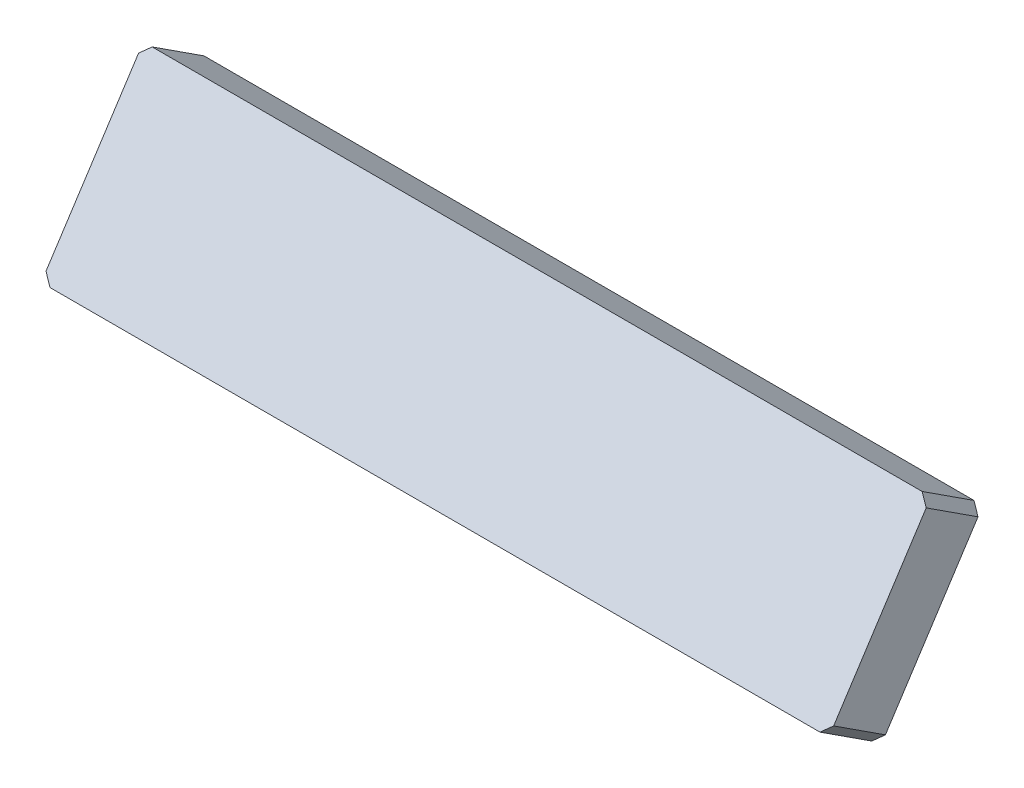
ISO-10303-21;
HEADER;
FILE_DESCRIPTION(('STEP AP214'),'2;1');
FILE_NAME('part.step','',(''),(''),'','','');
FILE_SCHEMA(('AUTOMOTIVE_DESIGN { 1 0 10303 214 1 1 1 1 }'));
ENDSEC;
DATA;
#1=APPLICATION_CONTEXT('core data for automotive mechanical design processes');
#2=APPLICATION_PROTOCOL_DEFINITION('international standard','automotive_design',2000,#1);
#3=PRODUCT_CONTEXT('',#1,'mechanical');
#4=PRODUCT('Part','Part','',(#3));
#5=PRODUCT_RELATED_PRODUCT_CATEGORY('part','',(#4));
#6=PRODUCT_DEFINITION_FORMATION('','',#4);
#7=PRODUCT_DEFINITION_CONTEXT('part definition',#1,'design');
#8=PRODUCT_DEFINITION('design','',#6,#7);
#9=PRODUCT_DEFINITION_SHAPE('','',#8);
#10=(LENGTH_UNIT() NAMED_UNIT(*) SI_UNIT(.MILLI.,.METRE.));
#11=(NAMED_UNIT(*) PLANE_ANGLE_UNIT() SI_UNIT($,.RADIAN.));
#12=(NAMED_UNIT(*) SI_UNIT($,.STERADIAN.) SOLID_ANGLE_UNIT());
#13=UNCERTAINTY_MEASURE_WITH_UNIT(LENGTH_MEASURE(1.E-05),#10,'distance_accuracy_value','');
#14=(GEOMETRIC_REPRESENTATION_CONTEXT(3) GLOBAL_UNCERTAINTY_ASSIGNED_CONTEXT((#13)) GLOBAL_UNIT_ASSIGNED_CONTEXT((#10,
#11,#12)) REPRESENTATION_CONTEXT('',''));
#15=CARTESIAN_POINT('',(0.,0.,0.));
#16=DIRECTION('',(0.,0.,1.));
#17=DIRECTION('',(1.,0.,0.));
#18=AXIS2_PLACEMENT_3D('',#15,#16,#17);
#19=CARTESIAN_POINT('',(0.,5.65083347470302,8.70152048404578));
#20=DIRECTION('',(0.,0.544639035015028,0.838670567945423));
#21=DIRECTION('',(0.,-0.838670567945423,0.544639035015028));
#22=AXIS2_PLACEMENT_3D('',#19,#20,#21);
#23=PLANE('',#22);
#24=DIRECTION('',(-1.,0.,0.));
#25=VECTOR('',#24,1.);
#26=CARTESIAN_POINT('',(-70.85,6.22882369253435,8.32616924779223));
#27=LINE('',#26,#25);
#28=CARTESIAN_POINT('',(69.2625,6.22882369253434,8.32616924779223));
#29=VERTEX_POINT('',#28);
#30=CARTESIAN_POINT('',(-69.2625,6.22882369253435,8.32616924779223));
#31=VERTEX_POINT('',#30);
#32=EDGE_CURVE('E172',#29,#31,#27,.T.);
#33=ORIENTED_EDGE('',*,*,#32,.T.);
#34=DIRECTION('',(0.,0.838670567945423,-0.544639035015028));
#35=VECTOR('',#34,1.);
#36=CARTESIAN_POINT('',(-69.2625,5.65083347470302,8.70152048404578));
#37=LINE('',#36,#35);
#38=CARTESIAN_POINT('',(-69.2625,31.8711763074657,-8.32616924779225));
#39=VERTEX_POINT('',#38);
#40=EDGE_CURVE('E175',#31,#39,#37,.T.);
#41=ORIENTED_EDGE('',*,*,#40,.T.);
#42=DIRECTION('',(1.,0.,0.));
#43=VECTOR('',#42,1.);
#44=CARTESIAN_POINT('',(0.,31.8711763074657,-8.32616924779225));
#45=LINE('',#44,#43);
#46=CARTESIAN_POINT('',(69.2625,31.8711763074656,-8.32616924779225));
#47=VERTEX_POINT('',#46);
#48=EDGE_CURVE('E166',#39,#47,#45,.T.);
#49=ORIENTED_EDGE('',*,*,#48,.T.);
#50=DIRECTION('',(0.,-0.838670567945423,0.544639035015028));
#51=VECTOR('',#50,1.);
#52=CARTESIAN_POINT('',(69.2625,4.89743416592097,9.1907837158786));
#53=LINE('',#52,#51);
#54=EDGE_CURVE('E169',#47,#29,#53,.T.);
#55=ORIENTED_EDGE('',*,*,#54,.T.);
#56=EDGE_LOOP('',(#33,#41,#49,#55));
#57=FACE_BOUND('',#56,.T.);
#58=CARTESIAN_POINT('',(-50.8,19.05,0.));
#59=DIRECTION('',(0.,0.544639035015028,0.838670567945423));
#60=DIRECTION('',(0.,-0.838670567945423,0.544639035015028));
#61=AXIS2_PLACEMENT_3D('',#58,#59,#60);
#62=ELLIPSE('',#61,13.9541962867026,7.6);
#63=CARTESIAN_POINT('',(-50.8,7.34702627500917,7.60000000000002));
#64=VERTEX_POINT('',#63);
#65=EDGE_CURVE('E268',#64,#64,#62,.T.);
#66=ORIENTED_EDGE('',*,*,#65,.T.);
#67=EDGE_LOOP('',(#66));
#68=FACE_BOUND('',#67,.T.);
#69=CARTESIAN_POINT('',(50.8,19.05,0.));
#70=DIRECTION('',(0.,0.544639035015028,0.838670567945423));
#71=DIRECTION('',(0.,-0.838670567945423,0.544639035015028));
#72=AXIS2_PLACEMENT_3D('',#69,#70,#71);
#73=ELLIPSE('',#72,13.9541962867026,7.6);
#74=CARTESIAN_POINT('',(50.8,7.34702627500921,7.59999999999998));
#75=VERTEX_POINT('',#74);
#76=EDGE_CURVE('E154',#75,#75,#73,.F.);
#77=ORIENTED_EDGE('',*,*,#76,.F.);
#78=EDGE_LOOP('',(#77));
#79=FACE_BOUND('',#78,.T.);
#80=ADVANCED_FACE('F47',(#57,#68,#79),#23,.F.);
#81=CARTESIAN_POINT('',(-50.8,19.05,0.));
#82=DIRECTION('',(0.,-1.,0.));
#83=DIRECTION('',(0.,0.,-1.));
#84=AXIS2_PLACEMENT_3D('',#81,#82,#83);
#85=CYLINDRICAL_SURFACE('',#84,7.6);
#86=CARTESIAN_POINT('',(-50.8,0.,0.));
#87=DIRECTION('',(0.,1.,0.));
#88=DIRECTION('',(0.,0.,1.));
#89=AXIS2_PLACEMENT_3D('',#86,#87,#88);
#90=CIRCLE('',#89,7.6);
#91=CARTESIAN_POINT('',(-50.8,0.,7.60000000000001));
#92=VERTEX_POINT('',#91);
#93=EDGE_CURVE('E160',#92,#92,#90,.T.);
#94=ORIENTED_EDGE('',*,*,#93,.T.);
#95=EDGE_LOOP('',(#94));
#96=FACE_BOUND('',#95,.T.);
#97=ORIENTED_EDGE('',*,*,#65,.F.);
#98=EDGE_LOOP('',(#97));
#99=FACE_BOUND('',#98,.T.);
#100=ADVANCED_FACE('F275',(#96,#99),#85,.T.);
#101=CARTESIAN_POINT('',(-50.8,0.,0.));
#102=DIRECTION('',(0.,1.,0.));
#103=DIRECTION('',(0.,0.,1.));
#104=AXIS2_PLACEMENT_3D('',#101,#102,#103);
#105=PLANE('',#104);
#106=ORIENTED_EDGE('',*,*,#93,.F.);
#107=EDGE_LOOP('',(#106));
#108=FACE_BOUND('',#107,.T.);
#109=ADVANCED_FACE('F278',(#108),#105,.F.);
#110=CARTESIAN_POINT('',(0.,40.1194815787699,1.46033249702826));
#111=DIRECTION('',(0.,-0.838670567945423,0.544639035015028));
#112=DIRECTION('',(0.,-0.544639035015028,-0.838670567945423));
#113=AXIS2_PLACEMENT_3D('',#110,#111,#112);
#114=PLANE('',#113);
#115=DIRECTION('',(-1.,0.,0.));
#116=VECTOR('',#115,1.);
#117=CARTESIAN_POINT('',(0.,40.1194815787699,1.46033249702826));
#118=LINE('',#117,#116);
#119=CARTESIAN_POINT('',(69.2625,40.1194815787699,1.46033249702826));
#120=VERTEX_POINT('',#119);
#121=CARTESIAN_POINT('',(-69.2625,40.1194815787699,1.46033249702827));
#122=VERTEX_POINT('',#121);
#123=EDGE_CURVE('E131',#120,#122,#118,.T.);
#124=ORIENTED_EDGE('',*,*,#123,.F.);
#125=DIRECTION('',(0.,-0.544639035015028,-0.838670567945423));
#126=VECTOR('',#125,1.);
#127=CARTESIAN_POINT('',(69.2625,33.202565834079,-9.19078371587862));
#128=LINE('',#127,#126);
#129=CARTESIAN_POINT('',(69.2625,34.0671803021654,-7.85939418926524));
#130=VERTEX_POINT('',#129);
#131=EDGE_CURVE('E11',#120,#130,#128,.T.);
#132=ORIENTED_EDGE('',*,*,#131,.T.);
#133=DIRECTION('',(-1.,0.,0.));
#134=VECTOR('',#133,1.);
#135=CARTESIAN_POINT('',(0.,34.0671803021654,-7.85939418926524));
#136=LINE('',#135,#134);
#137=CARTESIAN_POINT('',(-69.2625,34.0671803021654,-7.85939418926523));
#138=VERTEX_POINT('',#137);
#139=EDGE_CURVE('E58',#130,#138,#136,.T.);
#140=ORIENTED_EDGE('',*,*,#139,.T.);
#141=DIRECTION('',(0.,0.544639035015028,0.838670567945423));
#142=VECTOR('',#141,1.);
#143=CARTESIAN_POINT('',(-69.2625,40.1194815787699,1.46033249702826));
#144=LINE('',#143,#142);
#145=EDGE_CURVE('E204',#138,#122,#144,.T.);
#146=ORIENTED_EDGE('',*,*,#145,.T.);
#147=EDGE_LOOP('',(#124,#132,#140,#146));
#148=FACE_BOUND('',#147,.T.);
#149=ADVANCED_FACE('F280',(#148),#114,.F.);
#150=CARTESIAN_POINT('',(-70.85,12.5677492193939,19.3526366969527));
#151=DIRECTION('',(1.,0.,0.));
#152=DIRECTION('',(0.,0.,-1.));
#153=AXIS2_PLACEMENT_3D('',#150,#151,#152);
#154=PLANE('',#153);
#155=DIRECTION('',(0.,-0.838670567945423,0.544639035015028));
#156=VECTOR('',#155,1.);
#157=CARTESIAN_POINT('',(-70.85,6.51544794278938,10.0329100106591));
#158=LINE('',#157,#156);
#159=CARTESIAN_POINT('',(-70.85,32.735790775552,-6.99477972117888));
#160=VERTEX_POINT('',#159);
#161=CARTESIAN_POINT('',(-70.85,7.09343816062071,9.6575587744056));
#162=VERTEX_POINT('',#161);
#163=EDGE_CURVE('E153',#160,#162,#158,.T.);
#164=ORIENTED_EDGE('',*,*,#163,.T.);
#165=DIRECTION('',(0.,0.544639035015028,0.838670567945424));
#166=VECTOR('',#165,1.);
#167=CARTESIAN_POINT('',(-70.85,13.1457394372252,18.9772854606991));
#168=LINE('',#167,#166);
#169=CARTESIAN_POINT('',(-70.85,13.1457394372252,18.9772854606991));
#170=VERTEX_POINT('',#169);
#171=EDGE_CURVE('E144',#162,#170,#168,.T.);
#172=ORIENTED_EDGE('',*,*,#171,.T.);
#173=DIRECTION('',(0.,-0.838670567945423,0.544639035015028));
#174=VECTOR('',#173,1.);
#175=CARTESIAN_POINT('',(-70.85,12.5677492193939,19.3526366969527));
#176=LINE('',#175,#174);
#177=CARTESIAN_POINT('',(-70.85,38.7880920521565,2.32494696511463));
#178=VERTEX_POINT('',#177);
#179=EDGE_CURVE('E129',#178,#170,#176,.T.);
#180=ORIENTED_EDGE('',*,*,#179,.F.);
#181=DIRECTION('',(0.,-0.544639035015028,-0.838670567945424));
#182=VECTOR('',#181,1.);
#183=CARTESIAN_POINT('',(-70.85,38.7880920521565,2.32494696511463));
#184=LINE('',#183,#182);
#185=EDGE_CURVE('E141',#178,#160,#184,.T.);
#186=ORIENTED_EDGE('',*,*,#185,.T.);
#187=EDGE_LOOP('',(#164,#172,#180,#186));
#188=FACE_BOUND('',#187,.T.);
#189=ADVANCED_FACE('F140',(#188),#154,.F.);
#190=CARTESIAN_POINT('',(0.,11.8143499106118,19.8418999287855));
#191=DIRECTION('',(0.,-0.838670567945423,0.544639035015028));
#192=DIRECTION('',(0.,-0.544639035015028,-0.838670567945423));
#193=AXIS2_PLACEMENT_3D('',#190,#191,#192);
#194=PLANE('',#193);
#195=DIRECTION('',(-1.,0.,0.));
#196=VECTOR('',#195,1.);
#197=CARTESIAN_POINT('',(0.,11.8143499106118,19.8418999287855));
#198=LINE('',#197,#196);
#199=CARTESIAN_POINT('',(69.2625,11.8143499106118,19.8418999287855));
#200=VERTEX_POINT('',#199);
#201=CARTESIAN_POINT('',(-69.2625,11.8143499106118,19.8418999287855));
#202=VERTEX_POINT('',#201);
#203=EDGE_CURVE('E146',#200,#202,#198,.T.);
#204=ORIENTED_EDGE('',*,*,#203,.T.);
#205=DIRECTION('',(0.,-0.544639035015028,-0.838670567945423));
#206=VECTOR('',#205,1.);
#207=CARTESIAN_POINT('',(-69.2625,4.89743416592098,9.1907837158786));
#208=LINE('',#207,#206);
#209=CARTESIAN_POINT('',(-69.2625,5.76204863400735,10.522173242492));
#210=VERTEX_POINT('',#209);
#211=EDGE_CURVE('E136',#202,#210,#208,.T.);
#212=ORIENTED_EDGE('',*,*,#211,.T.);
#213=DIRECTION('',(1.,0.,0.));
#214=VECTOR('',#213,1.);
#215=CARTESIAN_POINT('',(70.85,5.76204863400734,10.522173242492));
#216=LINE('',#215,#214);
#217=CARTESIAN_POINT('',(69.2625,5.76204863400734,10.522173242492));
#218=VERTEX_POINT('',#217);
#219=EDGE_CURVE('E182',#210,#218,#216,.T.);
#220=ORIENTED_EDGE('',*,*,#219,.T.);
#221=DIRECTION('',(0.,0.544639035015028,0.838670567945423));
#222=VECTOR('',#221,1.);
#223=CARTESIAN_POINT('',(69.2625,11.8143499106118,19.8418999287855));
#224=LINE('',#223,#222);
#225=EDGE_CURVE('E179',#218,#200,#224,.T.);
#226=ORIENTED_EDGE('',*,*,#225,.T.);
#227=EDGE_LOOP('',(#204,#212,#220,#226));
#228=FACE_BOUND('',#227,.T.);
#229=ADVANCED_FACE('F300',(#228),#194,.T.);
#230=CARTESIAN_POINT('',(70.85,12.5677492193939,19.3526366969526));
#231=DIRECTION('',(1.,0.,0.));
#232=DIRECTION('',(0.,0.,-1.));
#233=AXIS2_PLACEMENT_3D('',#230,#231,#232);
#234=PLANE('',#233);
#235=DIRECTION('',(0.,-0.838670567945423,0.544639035015028));
#236=VECTOR('',#235,1.);
#237=CARTESIAN_POINT('',(70.85,12.5677492193939,19.3526366969526));
#238=LINE('',#237,#236);
#239=CARTESIAN_POINT('',(70.85,38.7880920521565,2.32494696511462));
#240=VERTEX_POINT('',#239);
#241=CARTESIAN_POINT('',(70.85,13.1457394372252,18.9772854606991));
#242=VERTEX_POINT('',#241);
#243=EDGE_CURVE('E264',#240,#242,#238,.T.);
#244=ORIENTED_EDGE('',*,*,#243,.T.);
#245=DIRECTION('',(0.,-0.544639035015028,-0.838670567945424));
#246=VECTOR('',#245,1.);
#247=CARTESIAN_POINT('',(70.85,13.1457394372252,18.9772854606991));
#248=LINE('',#247,#246);
#249=CARTESIAN_POINT('',(70.85,7.09343816062071,9.6575587744056));
#250=VERTEX_POINT('',#249);
#251=EDGE_CURVE('E201',#242,#250,#248,.T.);
#252=ORIENTED_EDGE('',*,*,#251,.T.);
#253=DIRECTION('',(0.,0.838670567945423,-0.544639035015028));
#254=VECTOR('',#253,1.);
#255=CARTESIAN_POINT('',(70.85,34.0671803021654,-7.85939418926524));
#256=LINE('',#255,#254);
#257=CARTESIAN_POINT('',(70.85,32.735790775552,-6.99477972117888));
#258=VERTEX_POINT('',#257);
#259=EDGE_CURVE('E198',#250,#258,#256,.T.);
#260=ORIENTED_EDGE('',*,*,#259,.T.);
#261=DIRECTION('',(0.,0.544639035015028,0.838670567945424));
#262=VECTOR('',#261,1.);
#263=CARTESIAN_POINT('',(70.85,38.7880920521565,2.32494696511462));
#264=LINE('',#263,#262);
#265=EDGE_CURVE('E195',#258,#240,#264,.T.);
#266=ORIENTED_EDGE('',*,*,#265,.T.);
#267=EDGE_LOOP('',(#244,#252,#260,#266));
#268=FACE_BOUND('',#267,.T.);
#269=ADVANCED_FACE('F297',(#268),#234,.T.);
#270=CARTESIAN_POINT('',(0.,12.5677492193939,19.3526366969527));
#271=DIRECTION('',(0.,0.544639035015028,0.838670567945423));
#272=DIRECTION('',(0.,-0.838670567945423,0.544639035015028));
#273=AXIS2_PLACEMENT_3D('',#270,#271,#272);
#274=PLANE('',#273);
#275=ORIENTED_EDGE('',*,*,#179,.T.);
#276=DIRECTION('',(0.70710678118655,-0.59302964577578,0.385117954958022));
#277=VECTOR('',#276,1.);
#278=CARTESIAN_POINT('',(-35.0804128403196,-16.8531605411571,38.4587988942333));
#279=LINE('',#278,#277);
#280=EDGE_CURVE('E192',#170,#202,#279,.T.);
#281=ORIENTED_EDGE('',*,*,#280,.T.);
#282=ORIENTED_EDGE('',*,*,#203,.F.);
#283=DIRECTION('',(-0.70710678118655,-0.59302964577578,0.385117954958023));
#284=VECTOR('',#283,1.);
#285=CARTESIAN_POINT('',(35.0804128403196,-16.8531605411571,38.4587988942332));
#286=LINE('',#285,#284);
#287=EDGE_CURVE('E189',#200,#242,#286,.F.);
#288=ORIENTED_EDGE('',*,*,#287,.T.);
#289=ORIENTED_EDGE('',*,*,#243,.F.);
#290=DIRECTION('',(-0.70710678118655,0.59302964577578,-0.385117954958023));
#291=VECTOR('',#290,1.);
#292=CARTESIAN_POINT('',(51.0570871596799,55.3878255052419,-8.45504598437379));
#293=LINE('',#292,#291);
#294=EDGE_CURVE('E135',#240,#120,#293,.T.);
#295=ORIENTED_EDGE('',*,*,#294,.T.);
#296=ORIENTED_EDGE('',*,*,#123,.T.);
#297=DIRECTION('',(0.70710678118655,0.59302964577578,-0.385117954958022));
#298=VECTOR('',#297,1.);
#299=CARTESIAN_POINT('',(-51.0570871596799,55.3878255052419,-8.4550459843738));
#300=LINE('',#299,#298);
#301=EDGE_CURVE('E126',#122,#178,#300,.F.);
#302=ORIENTED_EDGE('',*,*,#301,.T.);
#303=EDGE_LOOP('',(#275,#281,#282,#288,#289,#295,#296,#302));
#304=FACE_BOUND('',#303,.T.);
#305=ADVANCED_FACE('F128',(#304),#274,.T.);
#306=CARTESIAN_POINT('',(50.8,19.05,0.));
#307=DIRECTION('',(0.,-1.,0.));
#308=DIRECTION('',(0.,0.,-1.));
#309=AXIS2_PLACEMENT_3D('',#306,#307,#308);
#310=CYLINDRICAL_SURFACE('',#309,7.6);
#311=CARTESIAN_POINT('',(50.8,0.,0.));
#312=DIRECTION('',(0.,1.,0.));
#313=DIRECTION('',(0.,0.,1.));
#314=AXIS2_PLACEMENT_3D('',#311,#312,#313);
#315=CIRCLE('',#314,7.6);
#316=CARTESIAN_POINT('',(50.8,0.,7.59999999999998));
#317=VERTEX_POINT('',#316);
#318=EDGE_CURVE('E251',#317,#317,#315,.T.);
#319=ORIENTED_EDGE('',*,*,#318,.T.);
#320=EDGE_LOOP('',(#319));
#321=FACE_BOUND('',#320,.T.);
#322=ORIENTED_EDGE('',*,*,#76,.T.);
#323=EDGE_LOOP('',(#322));
#324=FACE_BOUND('',#323,.T.);
#325=ADVANCED_FACE('F324',(#321,#324),#310,.T.);
#326=CARTESIAN_POINT('',(50.8,0.,0.));
#327=DIRECTION('',(0.,1.,0.));
#328=DIRECTION('',(0.,0.,1.));
#329=AXIS2_PLACEMENT_3D('',#326,#327,#328);
#330=PLANE('',#329);
#331=ORIENTED_EDGE('',*,*,#318,.F.);
#332=EDGE_LOOP('',(#331));
#333=FACE_BOUND('',#332,.T.);
#334=ADVANCED_FACE('F331',(#333),#330,.F.);
#335=CARTESIAN_POINT('',(69.2625,40.1194815787699,1.46033249702826));
#336=DIRECTION('',(0.707106781186545,0.593029645775784,-0.385117954958025));
#337=DIRECTION('',(0.,0.544639035015028,0.838670567945423));
#338=AXIS2_PLACEMENT_3D('',#335,#336,#337);
#339=PLANE('',#338);
#340=ORIENTED_EDGE('',*,*,#294,.F.);
#341=ORIENTED_EDGE('',*,*,#265,.F.);
#342=DIRECTION('',(0.70710678118655,-0.593029645775779,0.385117954958023));
#343=VECTOR('',#342,1.);
#344=CARTESIAN_POINT('',(70.85,32.735790775552,-6.99477972117888));
#345=LINE('',#344,#343);
#346=EDGE_CURVE('E244',#130,#258,#345,.T.);
#347=ORIENTED_EDGE('',*,*,#346,.F.);
#348=ORIENTED_EDGE('',*,*,#131,.F.);
#349=EDGE_LOOP('',(#340,#341,#347,#348));
#350=FACE_BOUND('',#349,.T.);
#351=ADVANCED_FACE('F50',(#350),#339,.T.);
#352=CARTESIAN_POINT('',(70.85,13.1457394372252,18.9772854606991));
#353=DIRECTION('',(-0.707106781186545,0.593029645775784,-0.385117954958025));
#354=DIRECTION('',(0.,-0.544639035015028,-0.838670567945423));
#355=AXIS2_PLACEMENT_3D('',#352,#353,#354);
#356=PLANE('',#355);
#357=ORIENTED_EDGE('',*,*,#287,.F.);
#358=ORIENTED_EDGE('',*,*,#225,.F.);
#359=DIRECTION('',(0.70710678118655,0.59302964577578,-0.385117954958022));
#360=VECTOR('',#359,1.);
#361=CARTESIAN_POINT('',(69.2625,5.76204863400734,10.522173242492));
#362=LINE('',#361,#360);
#363=EDGE_CURVE('E241',#250,#218,#362,.F.);
#364=ORIENTED_EDGE('',*,*,#363,.F.);
#365=ORIENTED_EDGE('',*,*,#251,.F.);
#366=EDGE_LOOP('',(#357,#358,#364,#365));
#367=FACE_BOUND('',#366,.T.);
#368=ADVANCED_FACE('F344',(#367),#356,.F.);
#369=CARTESIAN_POINT('',(69.2625,5.65083347470302,8.70152048404577));
#370=DIRECTION('',(0.70710678118655,-0.385117954958022,-0.59302964577578));
#371=DIRECTION('',(0.,0.838670567945423,-0.544639035015028));
#372=AXIS2_PLACEMENT_3D('',#369,#370,#371);
#373=PLANE('',#372);
#374=DIRECTION('',(-0.707106781186545,-0.385117954958026,-0.593029645775784));
#375=VECTOR('',#374,1.);
#376=CARTESIAN_POINT('',(70.85,32.735790775552,-6.99477972117888));
#377=LINE('',#376,#375);
#378=EDGE_CURVE('E52',#258,#47,#377,.T.);
#379=ORIENTED_EDGE('',*,*,#378,.F.);
#380=ORIENTED_EDGE('',*,*,#259,.F.);
#381=DIRECTION('',(0.707106781186545,0.385117954958026,0.593029645775784));
#382=VECTOR('',#381,1.);
#383=CARTESIAN_POINT('',(70.05625,6.66113092657752,8.99186401109891));
#384=LINE('',#383,#382);
#385=EDGE_CURVE('E237',#29,#250,#384,.T.);
#386=ORIENTED_EDGE('',*,*,#385,.F.);
#387=ORIENTED_EDGE('',*,*,#54,.F.);
#388=EDGE_LOOP('',(#379,#380,#386,#387));
#389=FACE_BOUND('',#388,.T.);
#390=ADVANCED_FACE('F351',(#389),#373,.T.);
#391=CARTESIAN_POINT('',(70.85,32.735790775552,-6.99477972117888));
#392=DIRECTION('',(0.577350269189626,0.169759184687607,-0.79865417164181));
#393=DIRECTION('',(-0.810416906773851,0.,-0.585853597083011));
#394=AXIS2_PLACEMENT_3D('',#391,#392,#393);
#395=PLANE('',#394);
#396=ORIENTED_EDGE('',*,*,#346,.T.);
#397=ORIENTED_EDGE('',*,*,#378,.T.);
#398=DIRECTION('',(0.,-0.978147600733805,-0.207911690817761));
#399=VECTOR('',#398,1.);
#400=CARTESIAN_POINT('',(69.2625,32.9691783048155,-8.09278171852875));
#401=LINE('',#400,#399);
#402=EDGE_CURVE('E233',#130,#47,#401,.T.);
#403=ORIENTED_EDGE('',*,*,#402,.F.);
#404=EDGE_LOOP('',(#396,#397,#403));
#405=FACE_BOUND('',#404,.T.);
#406=ADVANCED_FACE('F358',(#405),#395,.T.);
#407=CARTESIAN_POINT('',(69.2625,5.76204863400734,10.522173242492));
#408=DIRECTION('',(0.577350269189626,-0.798654171641812,-0.169759184687596));
#409=DIRECTION('',(0.810416906773852,0.58585359708301,0.));
#410=AXIS2_PLACEMENT_3D('',#407,#408,#409);
#411=PLANE('',#410);
#412=ORIENTED_EDGE('',*,*,#385,.T.);
#413=ORIENTED_EDGE('',*,*,#363,.T.);
#414=DIRECTION('',(0.,0.207911690817755,-0.978147600733806));
#415=VECTOR('',#414,1.);
#416=CARTESIAN_POINT('',(69.2625,5.76204863400734,10.522173242492));
#417=LINE('',#416,#415);
#418=EDGE_CURVE('E229',#29,#218,#417,.F.);
#419=ORIENTED_EDGE('',*,*,#418,.F.);
#420=EDGE_LOOP('',(#412,#413,#419));
#421=FACE_BOUND('',#420,.T.);
#422=ADVANCED_FACE('F366',(#421),#411,.T.);
#423=CARTESIAN_POINT('',(0.,34.0671803021654,-7.85939418926524));
#424=DIRECTION('',(0.,-0.207911690817761,0.978147600733805));
#425=DIRECTION('',(-1.,0.,0.));
#426=AXIS2_PLACEMENT_3D('',#423,#424,#425);
#427=PLANE('',#426);
#428=ORIENTED_EDGE('',*,*,#402,.T.);
#429=ORIENTED_EDGE('',*,*,#48,.F.);
#430=DIRECTION('',(0.,0.978147600733805,0.207911690817761));
#431=VECTOR('',#430,1.);
#432=CARTESIAN_POINT('',(-69.2625,31.8711763074657,-8.32616924779225));
#433=LINE('',#432,#431);
#434=EDGE_CURVE('E225',#138,#39,#433,.F.);
#435=ORIENTED_EDGE('',*,*,#434,.F.);
#436=ORIENTED_EDGE('',*,*,#139,.F.);
#437=EDGE_LOOP('',(#428,#429,#435,#436));
#438=FACE_BOUND('',#437,.T.);
#439=ADVANCED_FACE('F373',(#438),#427,.F.);
#440=CARTESIAN_POINT('',(-70.85,38.7880920521565,2.32494696511463));
#441=DIRECTION('',(0.707106781186545,-0.593029645775784,0.385117954958025));
#442=DIRECTION('',(0.,-0.544639035015028,-0.838670567945423));
#443=AXIS2_PLACEMENT_3D('',#440,#441,#442);
#444=PLANE('',#443);
#445=ORIENTED_EDGE('',*,*,#301,.F.);
#446=ORIENTED_EDGE('',*,*,#145,.F.);
#447=DIRECTION('',(-0.70710678118655,-0.593029645775782,0.385117954958019));
#448=VECTOR('',#447,1.);
#449=CARTESIAN_POINT('',(-70.05625,33.4014855388587,-7.42708695522206));
#450=LINE('',#449,#448);
#451=EDGE_CURVE('E150',#160,#138,#450,.F.);
#452=ORIENTED_EDGE('',*,*,#451,.F.);
#453=ORIENTED_EDGE('',*,*,#185,.F.);
#454=EDGE_LOOP('',(#445,#446,#452,#453));
#455=FACE_BOUND('',#454,.T.);
#456=ADVANCED_FACE('F148',(#455),#444,.F.);
#457=CARTESIAN_POINT('',(-69.2625,11.8143499106118,19.8418999287855));
#458=DIRECTION('',(-0.707106781186545,-0.593029645775784,0.385117954958025));
#459=DIRECTION('',(0.,0.544639035015028,0.838670567945423));
#460=AXIS2_PLACEMENT_3D('',#457,#458,#459);
#461=PLANE('',#460);
#462=ORIENTED_EDGE('',*,*,#280,.F.);
#463=ORIENTED_EDGE('',*,*,#171,.F.);
#464=DIRECTION('',(-0.70710678118655,0.593029645775778,-0.385117954958026));
#465=VECTOR('',#464,1.);
#466=CARTESIAN_POINT('',(-70.85,7.09343816062071,9.6575587744056));
#467=LINE('',#466,#465);
#468=EDGE_CURVE('E219',#210,#162,#467,.T.);
#469=ORIENTED_EDGE('',*,*,#468,.F.);
#470=ORIENTED_EDGE('',*,*,#211,.F.);
#471=EDGE_LOOP('',(#462,#463,#469,#470));
#472=FACE_BOUND('',#471,.T.);
#473=ADVANCED_FACE('F388',(#472),#461,.T.);
#474=CARTESIAN_POINT('',(0.,6.22882369253435,8.32616924779223));
#475=DIRECTION('',(0.,-0.978147600733806,-0.207911690817755));
#476=DIRECTION('',(1.,0.,0.));
#477=AXIS2_PLACEMENT_3D('',#474,#475,#476);
#478=PLANE('',#477);
#479=ORIENTED_EDGE('',*,*,#418,.T.);
#480=ORIENTED_EDGE('',*,*,#219,.F.);
#481=DIRECTION('',(0.,-0.207911690817755,0.978147600733806));
#482=VECTOR('',#481,1.);
#483=CARTESIAN_POINT('',(-69.2625,5.99543616327085,9.4241712451421));
#484=LINE('',#483,#482);
#485=EDGE_CURVE('E215',#31,#210,#484,.T.);
#486=ORIENTED_EDGE('',*,*,#485,.F.);
#487=ORIENTED_EDGE('',*,*,#32,.F.);
#488=EDGE_LOOP('',(#479,#480,#486,#487));
#489=FACE_BOUND('',#488,.T.);
#490=ADVANCED_FACE('F395',(#489),#478,.T.);
#491=CARTESIAN_POINT('',(-69.2625,31.8711763074657,-8.32616924779225));
#492=DIRECTION('',(-0.577350269189622,0.169759184687605,-0.798654171641814));
#493=DIRECTION('',(-0.810416906773854,0.,0.585853597083006));
#494=AXIS2_PLACEMENT_3D('',#491,#492,#493);
#495=PLANE('',#494);
#496=ORIENTED_EDGE('',*,*,#451,.T.);
#497=ORIENTED_EDGE('',*,*,#434,.T.);
#498=DIRECTION('',(0.70710678118655,-0.385117954958022,-0.593029645775779));
#499=VECTOR('',#498,1.);
#500=CARTESIAN_POINT('',(-69.2625,31.8711763074657,-8.32616924779225));
#501=LINE('',#500,#499);
#502=EDGE_CURVE('E212',#160,#39,#501,.T.);
#503=ORIENTED_EDGE('',*,*,#502,.F.);
#504=EDGE_LOOP('',(#496,#497,#503));
#505=FACE_BOUND('',#504,.T.);
#506=ADVANCED_FACE('F403',(#505),#495,.T.);
#507=CARTESIAN_POINT('',(-70.85,7.09343816062071,9.6575587744056));
#508=DIRECTION('',(-0.577350269189622,-0.798654171641814,-0.1697591846876));
#509=DIRECTION('',(0.810416906773855,-0.585853597083006,0.));
#510=AXIS2_PLACEMENT_3D('',#507,#508,#509);
#511=PLANE('',#510);
#512=ORIENTED_EDGE('',*,*,#485,.T.);
#513=ORIENTED_EDGE('',*,*,#468,.T.);
#514=DIRECTION('',(-0.70710678118655,0.385117954958023,0.593029645775779));
#515=VECTOR('',#514,1.);
#516=CARTESIAN_POINT('',(-70.85,7.09343816062071,9.6575587744056));
#517=LINE('',#516,#515);
#518=EDGE_CURVE('E209',#31,#162,#517,.T.);
#519=ORIENTED_EDGE('',*,*,#518,.F.);
#520=EDGE_LOOP('',(#512,#513,#519));
#521=FACE_BOUND('',#520,.T.);
#522=ADVANCED_FACE('F411',(#521),#511,.T.);
#523=CARTESIAN_POINT('',(-70.85,6.51544794278938,10.0329100106591));
#524=DIRECTION('',(0.707106781186545,0.385117954958025,0.593029645775784));
#525=DIRECTION('',(0.,-0.838670567945423,0.544639035015028));
#526=AXIS2_PLACEMENT_3D('',#523,#524,#525);
#527=PLANE('',#526);
#528=ORIENTED_EDGE('',*,*,#502,.T.);
#529=ORIENTED_EDGE('',*,*,#40,.F.);
#530=ORIENTED_EDGE('',*,*,#518,.T.);
#531=ORIENTED_EDGE('',*,*,#163,.F.);
#532=EDGE_LOOP('',(#528,#529,#530,#531));
#533=FACE_BOUND('',#532,.T.);
#534=ADVANCED_FACE('F419',(#533),#527,.F.);
#535=CLOSED_SHELL('',(#80,#100,#109,#149,#189,#229,#269,#305,#325,#334,#351,#368,#390,#406,#422,
#439,#456,#473,#490,#506,#522,#534));
#536=MANIFOLD_SOLID_BREP('B2',#535);
#537=ADVANCED_BREP_SHAPE_REPRESENTATION('',(#18,#536),#14);
#538=SHAPE_DEFINITION_REPRESENTATION(#9,#537);
ENDSEC;
END-ISO-10303-21;
